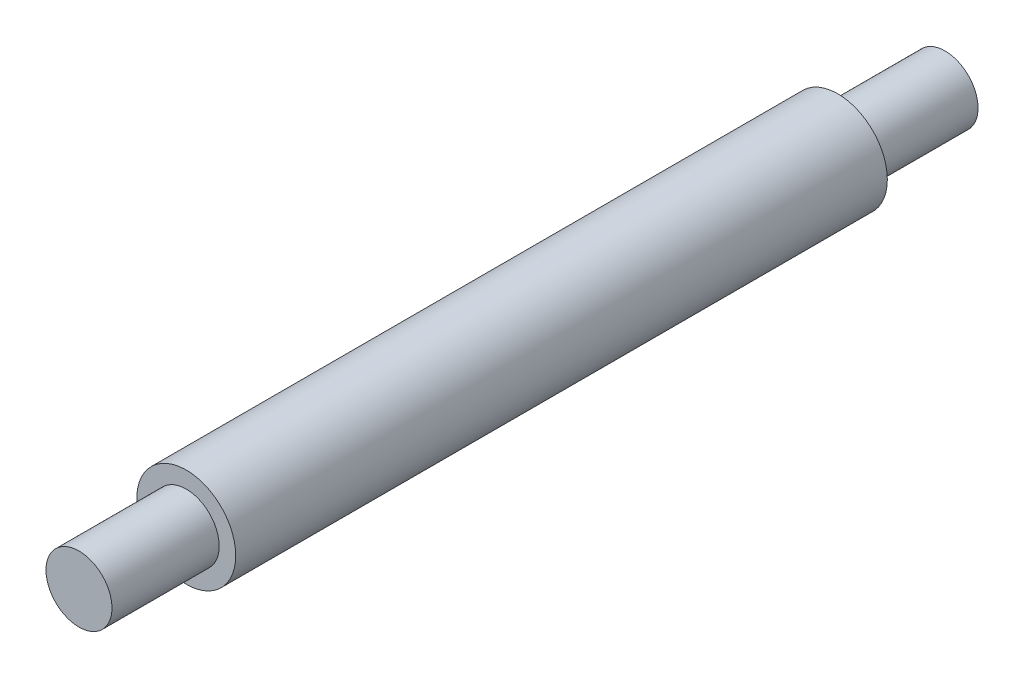
ISO-10303-21;
HEADER;
FILE_DESCRIPTION(('STEP AP214'),'2;1');
FILE_NAME('part.step','',(''),(''),'','','');
FILE_SCHEMA(('AUTOMOTIVE_DESIGN { 1 0 10303 214 1 1 1 1 }'));
ENDSEC;
DATA;
#1=APPLICATION_CONTEXT('core data for automotive mechanical design processes');
#2=APPLICATION_PROTOCOL_DEFINITION('international standard','automotive_design',2000,#1);
#3=PRODUCT_CONTEXT('',#1,'mechanical');
#4=PRODUCT('Part','Part','',(#3));
#5=PRODUCT_RELATED_PRODUCT_CATEGORY('part','',(#4));
#6=PRODUCT_DEFINITION_FORMATION('','',#4);
#7=PRODUCT_DEFINITION_CONTEXT('part definition',#1,'design');
#8=PRODUCT_DEFINITION('design','',#6,#7);
#9=PRODUCT_DEFINITION_SHAPE('','',#8);
#10=(LENGTH_UNIT() NAMED_UNIT(*) SI_UNIT(.MILLI.,.METRE.));
#11=(NAMED_UNIT(*) PLANE_ANGLE_UNIT() SI_UNIT($,.RADIAN.));
#12=(NAMED_UNIT(*) SI_UNIT($,.STERADIAN.) SOLID_ANGLE_UNIT());
#13=UNCERTAINTY_MEASURE_WITH_UNIT(LENGTH_MEASURE(1.E-05),#10,'distance_accuracy_value','');
#14=(GEOMETRIC_REPRESENTATION_CONTEXT(3) GLOBAL_UNCERTAINTY_ASSIGNED_CONTEXT((#13)) GLOBAL_UNIT_ASSIGNED_CONTEXT((#10,
#11,#12)) REPRESENTATION_CONTEXT('',''));
#15=CARTESIAN_POINT('',(0.,0.,0.));
#16=DIRECTION('',(0.,0.,1.));
#17=DIRECTION('',(1.,0.,0.));
#18=AXIS2_PLACEMENT_3D('',#15,#16,#17);
#19=CARTESIAN_POINT('',(0.,0.,13.));
#20=DIRECTION('',(0.,0.,-1.));
#21=DIRECTION('',(-1.,0.,0.));
#22=AXIS2_PLACEMENT_3D('',#19,#20,#21);
#23=CYLINDRICAL_SURFACE('',#22,4.);
#24=CARTESIAN_POINT('',(0.,0.,13.));
#25=DIRECTION('',(0.,0.,1.));
#26=DIRECTION('',(1.,0.,0.));
#27=AXIS2_PLACEMENT_3D('',#24,#25,#26);
#28=CIRCLE('',#27,4.);
#29=CARTESIAN_POINT('',(-4.,0.,13.));
#30=VERTEX_POINT('',#29);
#31=EDGE_CURVE('E45',#30,#30,#28,.T.);
#32=CARTESIAN_POINT('',(0.,0.,0.));
#33=DIRECTION('',(0.,0.,1.));
#34=DIRECTION('',(1.,0.,0.));
#35=AXIS2_PLACEMENT_3D('',#32,#33,#34);
#36=CIRCLE('',#35,4.);
#37=CARTESIAN_POINT('',(-4.,0.,0.));
#38=VERTEX_POINT('',#37);
#39=EDGE_CURVE('E40',#38,#38,#36,.T.);
#40=CARTESIAN_POINT('',(-4.,0.,13.));
#41=CARTESIAN_POINT('',(-4.,0.,12.8645833333333));
#42=CARTESIAN_POINT('',(-4.,0.,12.7291666666667));
#43=CARTESIAN_POINT('',(-4.,0.,12.4583333333333));
#44=CARTESIAN_POINT('',(-4.,0.,12.3229166666667));
#45=CARTESIAN_POINT('',(-4.,0.,12.0520833333333));
#46=CARTESIAN_POINT('',(-4.,0.,11.9166666666667));
#47=CARTESIAN_POINT('',(-4.,0.,11.6458333333333));
#48=CARTESIAN_POINT('',(-4.,0.,11.5104166666667));
#49=CARTESIAN_POINT('',(-4.,0.,11.2395833333333));
#50=CARTESIAN_POINT('',(-4.,0.,11.1041666666667));
#51=CARTESIAN_POINT('',(-4.,0.,10.8333333333333));
#52=CARTESIAN_POINT('',(-4.,0.,10.6979166666667));
#53=CARTESIAN_POINT('',(-4.,0.,10.4270833333333));
#54=CARTESIAN_POINT('',(-4.,0.,10.2916666666667));
#55=CARTESIAN_POINT('',(-4.,0.,10.0208333333333));
#56=CARTESIAN_POINT('',(-4.,0.,9.88541666666667));
#57=CARTESIAN_POINT('',(-4.,0.,9.61458333333333));
#58=CARTESIAN_POINT('',(-4.,0.,9.47916666666667));
#59=CARTESIAN_POINT('',(-4.,0.,9.20833333333333));
#60=CARTESIAN_POINT('',(-4.,0.,9.07291666666667));
#61=CARTESIAN_POINT('',(-4.,0.,8.80208333333333));
#62=CARTESIAN_POINT('',(-4.,0.,8.66666666666667));
#63=CARTESIAN_POINT('',(-4.,0.,8.39583333333333));
#64=CARTESIAN_POINT('',(-4.,0.,8.26041666666667));
#65=CARTESIAN_POINT('',(-4.,0.,7.98958333333333));
#66=CARTESIAN_POINT('',(-4.,0.,7.85416666666667));
#67=CARTESIAN_POINT('',(-4.,0.,7.58333333333333));
#68=CARTESIAN_POINT('',(-4.,0.,7.44791666666667));
#69=CARTESIAN_POINT('',(-4.,0.,7.17708333333333));
#70=CARTESIAN_POINT('',(-4.,0.,7.04166666666667));
#71=CARTESIAN_POINT('',(-4.,0.,6.77083333333333));
#72=CARTESIAN_POINT('',(-4.,0.,6.63541666666667));
#73=CARTESIAN_POINT('',(-4.,0.,6.36458333333333));
#74=CARTESIAN_POINT('',(-4.,0.,6.22916666666667));
#75=CARTESIAN_POINT('',(-4.,0.,5.95833333333333));
#76=CARTESIAN_POINT('',(-4.,0.,5.82291666666667));
#77=CARTESIAN_POINT('',(-4.,0.,5.55208333333333));
#78=CARTESIAN_POINT('',(-4.,0.,5.41666666666667));
#79=CARTESIAN_POINT('',(-4.,0.,5.14583333333333));
#80=CARTESIAN_POINT('',(-4.,0.,5.01041666666667));
#81=CARTESIAN_POINT('',(-4.,0.,4.73958333333333));
#82=CARTESIAN_POINT('',(-4.,0.,4.60416666666667));
#83=CARTESIAN_POINT('',(-4.,0.,4.33333333333333));
#84=CARTESIAN_POINT('',(-4.,0.,4.19791666666667));
#85=CARTESIAN_POINT('',(-4.,0.,3.92708333333333));
#86=CARTESIAN_POINT('',(-4.,0.,3.79166666666667));
#87=CARTESIAN_POINT('',(-4.,0.,3.52083333333333));
#88=CARTESIAN_POINT('',(-4.,0.,3.38541666666667));
#89=CARTESIAN_POINT('',(-4.,0.,3.11458333333333));
#90=CARTESIAN_POINT('',(-4.,0.,2.97916666666667));
#91=CARTESIAN_POINT('',(-4.,0.,2.70833333333333));
#92=CARTESIAN_POINT('',(-4.,0.,2.57291666666667));
#93=CARTESIAN_POINT('',(-4.,0.,2.30208333333333));
#94=CARTESIAN_POINT('',(-4.,0.,2.16666666666667));
#95=CARTESIAN_POINT('',(-4.,0.,1.89583333333333));
#96=CARTESIAN_POINT('',(-4.,0.,1.76041666666667));
#97=CARTESIAN_POINT('',(-4.,0.,1.48958333333333));
#98=CARTESIAN_POINT('',(-4.,0.,1.35416666666667));
#99=CARTESIAN_POINT('',(-4.,0.,1.08333333333333));
#100=CARTESIAN_POINT('',(-4.,0.,0.947916666666667));
#101=CARTESIAN_POINT('',(-4.,0.,0.677083333333334));
#102=CARTESIAN_POINT('',(-4.,0.,0.541666666666667));
#103=CARTESIAN_POINT('',(-4.,0.,0.270833333333334));
#104=CARTESIAN_POINT('',(-4.,0.,0.135416666666667));
#105=CARTESIAN_POINT('',(-4.,0.,0.));
#106=B_SPLINE_CURVE_WITH_KNOTS('',3,(#40,#41,#42,#43,#44,#45,#46,#47,#48,#49,#50,#51,#52,#53,
#54,#55,#56,#57,#58,#59,#60,#61,#62,#63,#64,#65,#66,#67,#68,#69,#70,#71,#72,#73,#74,#75,#76,#77,
#78,#79,#80,#81,#82,#83,#84,#85,#86,#87,#88,#89,#90,#91,#92,#93,#94,#95,#96,#97,#98,#99,#100,
#101,#102,#103,#104,#105),.UNSPECIFIED.,.F.,.F.,(4,2,2,2,2,2,2,2,2,2,2,2,2,2,2,2,2,2,2,2,2,2,2,
2,2,2,2,2,2,2,2,2,4),(0.,0.406249999999999,0.812499999999999,1.21875,1.625,2.03125,2.4375,
2.84375,3.25,3.65625,4.0625,4.46875,4.875,5.28125,5.6875,6.09375,6.5,6.90625,7.3125,7.71875,
8.125,8.53125,8.9375,9.34375,9.75,10.15625,10.5625,10.96875,11.375,11.78125,12.1875,12.59375,
13.),.UNSPECIFIED.);
#107=EDGE_CURVE('BSEAM37',#30,#38,#106,.T.);
#108=ORIENTED_EDGE('',*,*,#31,.F.);
#109=ORIENTED_EDGE('',*,*,#39,.T.);
#110=ORIENTED_EDGE('',*,*,#107,.T.);
#111=ORIENTED_EDGE('',*,*,#107,.F.);
#112=EDGE_LOOP('',(#108,#110,#109,#111));
#113=FACE_BOUND('',#112,.T.);
#114=ADVANCED_FACE('F37',(#113),#23,.T.);
#115=CARTESIAN_POINT('',(0.,0.,0.));
#116=DIRECTION('',(0.,0.,1.));
#117=DIRECTION('',(1.,0.,0.));
#118=AXIS2_PLACEMENT_3D('',#115,#116,#117);
#119=PLANE('',#118);
#120=ORIENTED_EDGE('',*,*,#39,.F.);
#121=EDGE_LOOP('',(#120));
#122=FACE_BOUND('',#121,.T.);
#123=ADVANCED_FACE('F83',(#122),#119,.F.);
#124=CARTESIAN_POINT('',(0.,0.,92.));
#125=DIRECTION('',(0.,0.,-1.));
#126=DIRECTION('',(-1.,0.,0.));
#127=AXIS2_PLACEMENT_3D('',#124,#125,#126);
#128=CYLINDRICAL_SURFACE('',#127,6.);
#129=CARTESIAN_POINT('',(0.,0.,92.));
#130=DIRECTION('',(0.,0.,1.));
#131=DIRECTION('',(1.,0.,0.));
#132=AXIS2_PLACEMENT_3D('',#129,#130,#131);
#133=CIRCLE('',#132,6.);
#134=CARTESIAN_POINT('',(6.,0.,92.));
#135=VERTEX_POINT('',#134);
#136=EDGE_CURVE('E54',#135,#135,#133,.T.);
#137=ORIENTED_EDGE('',*,*,#136,.F.);
#138=EDGE_LOOP('',(#137));
#139=FACE_BOUND('',#138,.T.);
#140=CARTESIAN_POINT('',(0.,0.,13.));
#141=DIRECTION('',(0.,0.,1.));
#142=DIRECTION('',(1.,0.,0.));
#143=AXIS2_PLACEMENT_3D('',#140,#141,#142);
#144=CIRCLE('',#143,6.);
#145=CARTESIAN_POINT('',(6.,0.,13.));
#146=VERTEX_POINT('',#145);
#147=EDGE_CURVE('E58',#146,#146,#144,.T.);
#148=ORIENTED_EDGE('',*,*,#147,.T.);
#149=EDGE_LOOP('',(#148));
#150=FACE_BOUND('',#149,.T.);
#151=ADVANCED_FACE('F88',(#139,#150),#128,.T.);
#152=CARTESIAN_POINT('',(0.,0.,92.));
#153=DIRECTION('',(0.,0.,1.));
#154=DIRECTION('',(1.,0.,0.));
#155=AXIS2_PLACEMENT_3D('',#152,#153,#154);
#156=PLANE('',#155);
#157=CARTESIAN_POINT('',(0.,0.,92.));
#158=DIRECTION('',(0.,0.,1.));
#159=DIRECTION('',(1.,0.,0.));
#160=AXIS2_PLACEMENT_3D('',#157,#158,#159);
#161=CIRCLE('',#160,4.);
#162=CARTESIAN_POINT('',(-4.,0.,92.));
#163=VERTEX_POINT('',#162);
#164=EDGE_CURVE('E10',#163,#163,#161,.T.);
#165=ORIENTED_EDGE('',*,*,#164,.F.);
#166=EDGE_LOOP('',(#165));
#167=FACE_BOUND('',#166,.T.);
#168=ORIENTED_EDGE('',*,*,#136,.T.);
#169=EDGE_LOOP('',(#168));
#170=FACE_BOUND('',#169,.T.);
#171=ADVANCED_FACE('F78',(#167,#170),#156,.T.);
#172=CARTESIAN_POINT('',(0.,0.,13.));
#173=DIRECTION('',(0.,0.,1.));
#174=DIRECTION('',(1.,0.,0.));
#175=AXIS2_PLACEMENT_3D('',#172,#173,#174);
#176=PLANE('',#175);
#177=ORIENTED_EDGE('',*,*,#31,.T.);
#178=EDGE_LOOP('',(#177));
#179=FACE_BOUND('',#178,.T.);
#180=ORIENTED_EDGE('',*,*,#147,.F.);
#181=EDGE_LOOP('',(#180));
#182=FACE_BOUND('',#181,.T.);
#183=ADVANCED_FACE('F71',(#179,#182),#176,.F.);
#184=CARTESIAN_POINT('',(0.,0.,105.));
#185=DIRECTION('',(0.,0.,-1.));
#186=DIRECTION('',(-1.,0.,0.));
#187=AXIS2_PLACEMENT_3D('',#184,#185,#186);
#188=CYLINDRICAL_SURFACE('',#187,4.);
#189=CARTESIAN_POINT('',(0.,0.,105.));
#190=DIRECTION('',(0.,0.,1.));
#191=DIRECTION('',(1.,0.,0.));
#192=AXIS2_PLACEMENT_3D('',#189,#190,#191);
#193=CIRCLE('',#192,4.);
#194=CARTESIAN_POINT('',(-4.,0.,105.));
#195=VERTEX_POINT('',#194);
#196=EDGE_CURVE('E53',#195,#195,#193,.T.);
#197=CARTESIAN_POINT('',(-4.,0.,105.));
#198=CARTESIAN_POINT('',(-4.,0.,104.864583333333));
#199=CARTESIAN_POINT('',(-4.,0.,104.729166666667));
#200=CARTESIAN_POINT('',(-4.,0.,104.458333333333));
#201=CARTESIAN_POINT('',(-4.,0.,104.322916666667));
#202=CARTESIAN_POINT('',(-4.,0.,104.052083333333));
#203=CARTESIAN_POINT('',(-4.,0.,103.916666666667));
#204=CARTESIAN_POINT('',(-4.,0.,103.645833333333));
#205=CARTESIAN_POINT('',(-4.,0.,103.510416666667));
#206=CARTESIAN_POINT('',(-4.,0.,103.239583333333));
#207=CARTESIAN_POINT('',(-4.,0.,103.104166666667));
#208=CARTESIAN_POINT('',(-4.,0.,102.833333333333));
#209=CARTESIAN_POINT('',(-4.,0.,102.697916666667));
#210=CARTESIAN_POINT('',(-4.,0.,102.427083333333));
#211=CARTESIAN_POINT('',(-4.,0.,102.291666666667));
#212=CARTESIAN_POINT('',(-4.,0.,102.020833333333));
#213=CARTESIAN_POINT('',(-4.,0.,101.885416666667));
#214=CARTESIAN_POINT('',(-4.,0.,101.614583333333));
#215=CARTESIAN_POINT('',(-4.,0.,101.479166666667));
#216=CARTESIAN_POINT('',(-4.,0.,101.208333333333));
#217=CARTESIAN_POINT('',(-4.,0.,101.072916666667));
#218=CARTESIAN_POINT('',(-4.,0.,100.802083333333));
#219=CARTESIAN_POINT('',(-4.,0.,100.666666666667));
#220=CARTESIAN_POINT('',(-4.,0.,100.395833333333));
#221=CARTESIAN_POINT('',(-4.,0.,100.260416666667));
#222=CARTESIAN_POINT('',(-4.,0.,99.9895833333333));
#223=CARTESIAN_POINT('',(-4.,0.,99.8541666666667));
#224=CARTESIAN_POINT('',(-4.,0.,99.5833333333333));
#225=CARTESIAN_POINT('',(-4.,0.,99.4479166666666));
#226=CARTESIAN_POINT('',(-4.,0.,99.1770833333333));
#227=CARTESIAN_POINT('',(-4.,0.,99.0416666666667));
#228=CARTESIAN_POINT('',(-4.,0.,98.7708333333333));
#229=CARTESIAN_POINT('',(-4.,0.,98.6354166666667));
#230=CARTESIAN_POINT('',(-4.,0.,98.3645833333333));
#231=CARTESIAN_POINT('',(-4.,0.,98.2291666666667));
#232=CARTESIAN_POINT('',(-4.,0.,97.9583333333333));
#233=CARTESIAN_POINT('',(-4.,0.,97.8229166666666));
#234=CARTESIAN_POINT('',(-4.,0.,97.5520833333333));
#235=CARTESIAN_POINT('',(-4.,0.,97.4166666666667));
#236=CARTESIAN_POINT('',(-4.,0.,97.1458333333333));
#237=CARTESIAN_POINT('',(-4.,0.,97.0104166666667));
#238=CARTESIAN_POINT('',(-4.,0.,96.7395833333333));
#239=CARTESIAN_POINT('',(-4.,0.,96.6041666666667));
#240=CARTESIAN_POINT('',(-4.,0.,96.3333333333333));
#241=CARTESIAN_POINT('',(-4.,0.,96.1979166666667));
#242=CARTESIAN_POINT('',(-4.,0.,95.9270833333333));
#243=CARTESIAN_POINT('',(-4.,0.,95.7916666666666));
#244=CARTESIAN_POINT('',(-4.,0.,95.5208333333333));
#245=CARTESIAN_POINT('',(-4.,0.,95.3854166666667));
#246=CARTESIAN_POINT('',(-4.,0.,95.1145833333333));
#247=CARTESIAN_POINT('',(-4.,0.,94.9791666666667));
#248=CARTESIAN_POINT('',(-4.,0.,94.7083333333333));
#249=CARTESIAN_POINT('',(-4.,0.,94.5729166666667));
#250=CARTESIAN_POINT('',(-4.,0.,94.3020833333333));
#251=CARTESIAN_POINT('',(-4.,0.,94.1666666666666));
#252=CARTESIAN_POINT('',(-4.,0.,93.8958333333333));
#253=CARTESIAN_POINT('',(-4.,0.,93.7604166666667));
#254=CARTESIAN_POINT('',(-4.,0.,93.4895833333333));
#255=CARTESIAN_POINT('',(-4.,0.,93.3541666666667));
#256=CARTESIAN_POINT('',(-4.,0.,93.0833333333333));
#257=CARTESIAN_POINT('',(-4.,0.,92.9479166666667));
#258=CARTESIAN_POINT('',(-4.,0.,92.6770833333333));
#259=CARTESIAN_POINT('',(-4.,0.,92.5416666666667));
#260=CARTESIAN_POINT('',(-4.,0.,92.2708333333333));
#261=CARTESIAN_POINT('',(-4.,0.,92.1354166666667));
#262=CARTESIAN_POINT('',(-4.,0.,92.));
#263=B_SPLINE_CURVE_WITH_KNOTS('',3,(#197,#198,#199,#200,#201,#202,#203,#204,#205,#206,#207,
#208,#209,#210,#211,#212,#213,#214,#215,#216,#217,#218,#219,#220,#221,#222,#223,#224,#225,#226,
#227,#228,#229,#230,#231,#232,#233,#234,#235,#236,#237,#238,#239,#240,#241,#242,#243,#244,#245,
#246,#247,#248,#249,#250,#251,#252,#253,#254,#255,#256,#257,#258,#259,#260,#261,#262),
.UNSPECIFIED.,.F.,.F.,(4,2,2,2,2,2,2,2,2,2,2,2,2,2,2,2,2,2,2,2,2,2,2,2,2,2,2,2,2,2,2,2,4),(0.,
0.406249999999997,0.812499999999994,1.21874999999999,1.62499999999999,2.03125,2.4375,
2.84374999999999,3.24999999999999,3.65625,4.0625,4.46874999999999,4.87499999999999,
5.28124999999999,5.6875,6.09374999999999,6.49999999999999,6.90624999999999,7.3125,7.71875,
8.12499999999999,8.53124999999999,8.93749999999999,9.34375,9.74999999999999,10.15625,10.5625,
10.96875,11.375,11.78125,12.1875,12.59375,13.),.UNSPECIFIED.);
#264=EDGE_CURVE('BSEAM69',#195,#163,#263,.T.);
#265=ORIENTED_EDGE('',*,*,#196,.F.);
#266=ORIENTED_EDGE('',*,*,#164,.T.);
#267=ORIENTED_EDGE('',*,*,#264,.T.);
#268=ORIENTED_EDGE('',*,*,#264,.F.);
#269=EDGE_LOOP('',(#265,#267,#266,#268));
#270=FACE_BOUND('',#269,.T.);
#271=ADVANCED_FACE('F69',(#270),#188,.T.);
#272=CARTESIAN_POINT('',(0.,0.,105.));
#273=DIRECTION('',(0.,0.,1.));
#274=DIRECTION('',(1.,0.,0.));
#275=AXIS2_PLACEMENT_3D('',#272,#273,#274);
#276=PLANE('',#275);
#277=ORIENTED_EDGE('',*,*,#196,.T.);
#278=EDGE_LOOP('',(#277));
#279=FACE_BOUND('',#278,.T.);
#280=ADVANCED_FACE('F67',(#279),#276,.T.);
#281=CLOSED_SHELL('',(#114,#123,#151,#171,#183,#271,#280));
#282=MANIFOLD_SOLID_BREP('B2',#281);
#283=ADVANCED_BREP_SHAPE_REPRESENTATION('',(#18,#282),#14);
#284=SHAPE_DEFINITION_REPRESENTATION(#9,#283);
ENDSEC;
END-ISO-10303-21;
